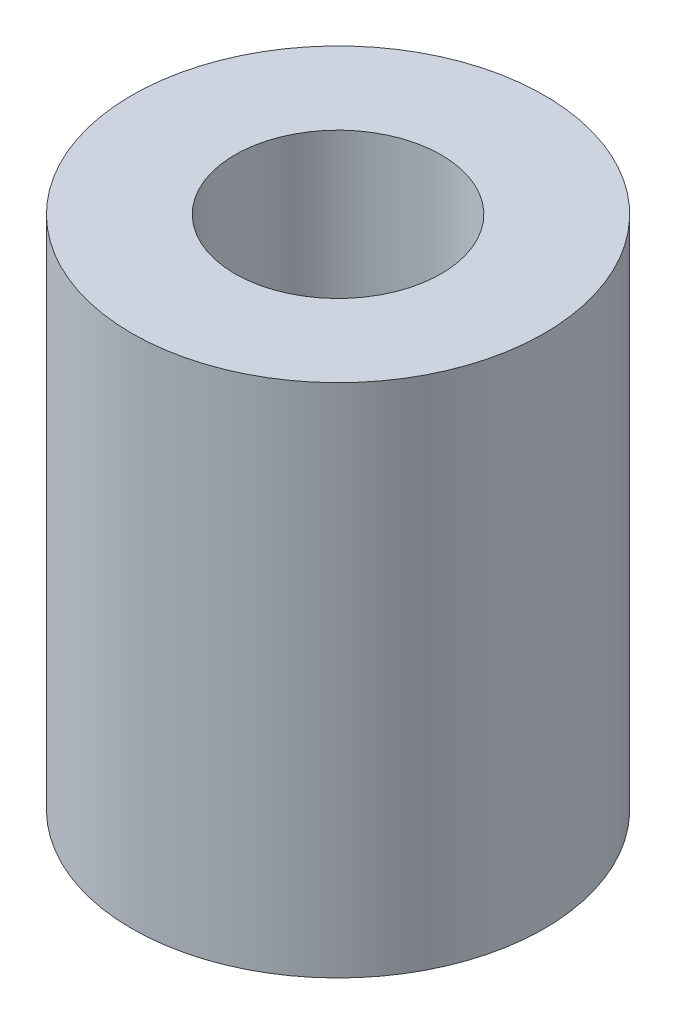
ISO-10303-21;
HEADER;
FILE_DESCRIPTION(('STEP AP214'),'2;1');
FILE_NAME('part.step','',(''),(''),'','','');
FILE_SCHEMA(('AUTOMOTIVE_DESIGN { 1 0 10303 214 1 1 1 1 }'));
ENDSEC;
DATA;
#1=APPLICATION_CONTEXT('core data for automotive mechanical design processes');
#2=APPLICATION_PROTOCOL_DEFINITION('international standard','automotive_design',2000,#1);
#3=PRODUCT_CONTEXT('',#1,'mechanical');
#4=PRODUCT('Part','Part','',(#3));
#5=PRODUCT_RELATED_PRODUCT_CATEGORY('part','',(#4));
#6=PRODUCT_DEFINITION_FORMATION('','',#4);
#7=PRODUCT_DEFINITION_CONTEXT('part definition',#1,'design');
#8=PRODUCT_DEFINITION('design','',#6,#7);
#9=PRODUCT_DEFINITION_SHAPE('','',#8);
#10=(LENGTH_UNIT() NAMED_UNIT(*) SI_UNIT(.MILLI.,.METRE.));
#11=(NAMED_UNIT(*) PLANE_ANGLE_UNIT() SI_UNIT($,.RADIAN.));
#12=(NAMED_UNIT(*) SI_UNIT($,.STERADIAN.) SOLID_ANGLE_UNIT());
#13=UNCERTAINTY_MEASURE_WITH_UNIT(LENGTH_MEASURE(1.E-05),#10,'distance_accuracy_value','');
#14=(GEOMETRIC_REPRESENTATION_CONTEXT(3) GLOBAL_UNCERTAINTY_ASSIGNED_CONTEXT((#13)) GLOBAL_UNIT_ASSIGNED_CONTEXT((#10,
#11,#12)) REPRESENTATION_CONTEXT('',''));
#15=CARTESIAN_POINT('',(0.,0.,0.));
#16=DIRECTION('',(0.,0.,1.));
#17=DIRECTION('',(1.,0.,0.));
#18=AXIS2_PLACEMENT_3D('',#15,#16,#17);
#19=CARTESIAN_POINT('',(0.,25.,0.));
#20=DIRECTION('',(0.,1.,0.));
#21=DIRECTION('',(0.,0.,1.));
#22=AXIS2_PLACEMENT_3D('',#19,#20,#21);
#23=PLANE('',#22);
#24=CARTESIAN_POINT('',(0.,25.,0.));
#25=DIRECTION('',(0.,1.,0.));
#26=DIRECTION('',(0.,0.,1.));
#27=AXIS2_PLACEMENT_3D('',#24,#25,#26);
#28=CIRCLE('',#27,10.);
#29=CARTESIAN_POINT('',(0.,25.,10.));
#30=VERTEX_POINT('',#29);
#31=EDGE_CURVE('E10',#30,#30,#28,.T.);
#32=ORIENTED_EDGE('',*,*,#31,.T.);
#33=EDGE_LOOP('',(#32));
#34=FACE_BOUND('',#33,.T.);
#35=CARTESIAN_POINT('',(0.,25.,0.));
#36=DIRECTION('',(0.,1.,0.));
#37=DIRECTION('',(0.,0.,1.));
#38=AXIS2_PLACEMENT_3D('',#35,#36,#37);
#39=CIRCLE('',#38,5.);
#40=CARTESIAN_POINT('',(0.,25.,5.));
#41=VERTEX_POINT('',#40);
#42=EDGE_CURVE('E42',#41,#41,#39,.T.);
#43=ORIENTED_EDGE('',*,*,#42,.F.);
#44=EDGE_LOOP('',(#43));
#45=FACE_BOUND('',#44,.T.);
#46=ADVANCED_FACE('F31',(#34,#45),#23,.T.);
#47=CARTESIAN_POINT('',(0.,0.,0.));
#48=DIRECTION('',(0.,1.,0.));
#49=DIRECTION('',(0.,0.,1.));
#50=AXIS2_PLACEMENT_3D('',#47,#48,#49);
#51=PLANE('',#50);
#52=CARTESIAN_POINT('',(0.,0.,0.));
#53=DIRECTION('',(0.,1.,0.));
#54=DIRECTION('',(0.,0.,1.));
#55=AXIS2_PLACEMENT_3D('',#52,#53,#54);
#56=CIRCLE('',#55,10.);
#57=CARTESIAN_POINT('',(0.,0.,10.));
#58=VERTEX_POINT('',#57);
#59=EDGE_CURVE('E35',#58,#58,#56,.T.);
#60=ORIENTED_EDGE('',*,*,#59,.F.);
#61=EDGE_LOOP('',(#60));
#62=FACE_BOUND('',#61,.T.);
#63=CARTESIAN_POINT('',(0.,0.,0.));
#64=DIRECTION('',(0.,1.,0.));
#65=DIRECTION('',(0.,0.,1.));
#66=AXIS2_PLACEMENT_3D('',#63,#64,#65);
#67=CIRCLE('',#66,5.);
#68=CARTESIAN_POINT('',(0.,0.,5.));
#69=VERTEX_POINT('',#68);
#70=EDGE_CURVE('E44',#69,#69,#67,.T.);
#71=ORIENTED_EDGE('',*,*,#70,.T.);
#72=EDGE_LOOP('',(#71));
#73=FACE_BOUND('',#72,.T.);
#74=ADVANCED_FACE('F54',(#62,#73),#51,.F.);
#75=CARTESIAN_POINT('',(0.,25.,0.));
#76=DIRECTION('',(0.,-1.,0.));
#77=DIRECTION('',(0.,0.,-1.));
#78=AXIS2_PLACEMENT_3D('',#75,#76,#77);
#79=CYLINDRICAL_SURFACE('',#78,10.);
#80=ORIENTED_EDGE('',*,*,#31,.F.);
#81=EDGE_LOOP('',(#80));
#82=FACE_BOUND('',#81,.T.);
#83=ORIENTED_EDGE('',*,*,#59,.T.);
#84=EDGE_LOOP('',(#83));
#85=FACE_BOUND('',#84,.T.);
#86=ADVANCED_FACE('F33',(#82,#85),#79,.T.);
#87=CARTESIAN_POINT('',(0.,25.,0.));
#88=DIRECTION('',(0.,-1.,0.));
#89=DIRECTION('',(0.,0.,-1.));
#90=AXIS2_PLACEMENT_3D('',#87,#88,#89);
#91=CYLINDRICAL_SURFACE('',#90,5.);
#92=ORIENTED_EDGE('',*,*,#42,.T.);
#93=EDGE_LOOP('',(#92));
#94=FACE_BOUND('',#93,.T.);
#95=ORIENTED_EDGE('',*,*,#70,.F.);
#96=EDGE_LOOP('',(#95));
#97=FACE_BOUND('',#96,.T.);
#98=ADVANCED_FACE('F50',(#94,#97),#91,.F.);
#99=CLOSED_SHELL('',(#46,#74,#86,#98));
#100=MANIFOLD_SOLID_BREP('B2',#99);
#101=ADVANCED_BREP_SHAPE_REPRESENTATION('',(#18,#100),#14);
#102=SHAPE_DEFINITION_REPRESENTATION(#9,#101);
ENDSEC;
END-ISO-10303-21;
